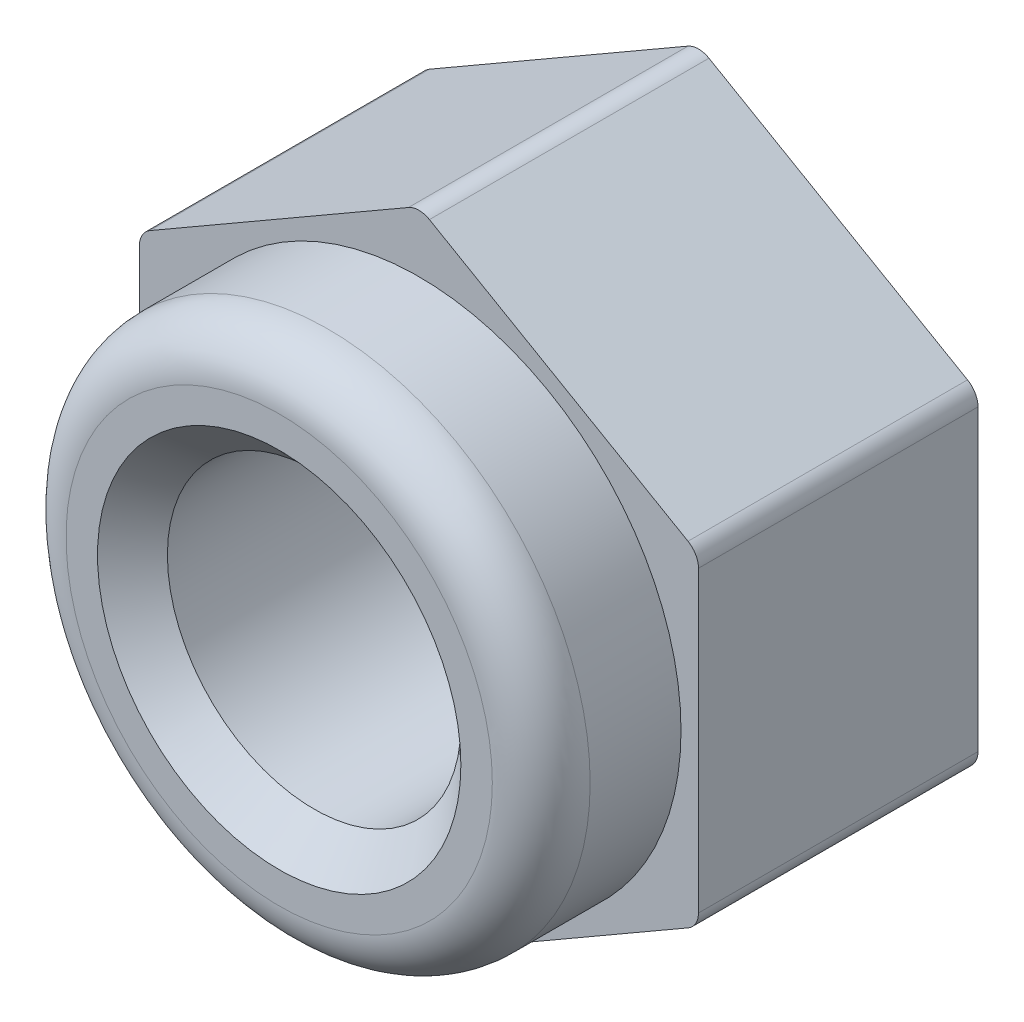
ISO-10303-21;
HEADER;
FILE_DESCRIPTION(('STEP AP214'),'2;1');
FILE_NAME('part.step','',(''),(''),'','','');
FILE_SCHEMA(('AUTOMOTIVE_DESIGN { 1 0 10303 214 1 1 1 1 }'));
ENDSEC;
DATA;
#1=APPLICATION_CONTEXT('core data for automotive mechanical design processes');
#2=APPLICATION_PROTOCOL_DEFINITION('international standard','automotive_design',2000,#1);
#3=PRODUCT_CONTEXT('',#1,'mechanical');
#4=PRODUCT('Part','Part','',(#3));
#5=PRODUCT_RELATED_PRODUCT_CATEGORY('part','',(#4));
#6=PRODUCT_DEFINITION_FORMATION('','',#4);
#7=PRODUCT_DEFINITION_CONTEXT('part definition',#1,'design');
#8=PRODUCT_DEFINITION('design','',#6,#7);
#9=PRODUCT_DEFINITION_SHAPE('','',#8);
#10=(LENGTH_UNIT() NAMED_UNIT(*) SI_UNIT(.MILLI.,.METRE.));
#11=(NAMED_UNIT(*) PLANE_ANGLE_UNIT() SI_UNIT($,.RADIAN.));
#12=(NAMED_UNIT(*) SI_UNIT($,.STERADIAN.) SOLID_ANGLE_UNIT());
#13=UNCERTAINTY_MEASURE_WITH_UNIT(LENGTH_MEASURE(1.E-05),#10,'distance_accuracy_value','');
#14=(GEOMETRIC_REPRESENTATION_CONTEXT(3) GLOBAL_UNCERTAINTY_ASSIGNED_CONTEXT((#13)) GLOBAL_UNIT_ASSIGNED_CONTEXT((#10,
#11,#12)) REPRESENTATION_CONTEXT('',''));
#15=CARTESIAN_POINT('',(0.,0.,0.));
#16=DIRECTION('',(0.,0.,1.));
#17=DIRECTION('',(1.,0.,0.));
#18=AXIS2_PLACEMENT_3D('',#15,#16,#17);
#19=CARTESIAN_POINT('',(-3.7,2.13619599600162,-4.));
#20=DIRECTION('',(0.,0.,1.));
#21=DIRECTION('',(1.,0.,0.));
#22=AXIS2_PLACEMENT_3D('',#19,#20,#21);
#23=CYLINDRICAL_SURFACE('',#22,0.3);
#24=CARTESIAN_POINT('',(-3.7,2.13619599600162,-4.));
#25=DIRECTION('',(0.,0.,-1.));
#26=DIRECTION('',(1.,0.,0.));
#27=AXIS2_PLACEMENT_3D('',#24,#25,#26);
#28=CIRCLE('',#27,0.3);
#29=CARTESIAN_POINT('',(-4.,2.13619599600162,-4.));
#30=VERTEX_POINT('',#29);
#31=CARTESIAN_POINT('',(-3.85,2.39600361713695,-4.));
#32=VERTEX_POINT('',#31);
#33=EDGE_CURVE('E174',#30,#32,#28,.T.);
#34=ORIENTED_EDGE('',*,*,#33,.F.);
#35=DIRECTION('',(0.,0.,-1.));
#36=VECTOR('',#35,1.);
#37=CARTESIAN_POINT('',(-4.,2.13619599600162,-4.));
#38=LINE('',#37,#36);
#39=CARTESIAN_POINT('',(-4.,2.13619599600162,0.));
#40=VERTEX_POINT('',#39);
#41=EDGE_CURVE('E190',#40,#30,#38,.T.);
#42=ORIENTED_EDGE('',*,*,#41,.F.);
#43=CARTESIAN_POINT('',(-3.7,2.13619599600162,0.));
#44=DIRECTION('',(0.,0.,1.));
#45=DIRECTION('',(1.,0.,0.));
#46=AXIS2_PLACEMENT_3D('',#43,#44,#45);
#47=CIRCLE('',#46,0.3);
#48=CARTESIAN_POINT('',(-3.85,2.39600361713695,0.));
#49=VERTEX_POINT('',#48);
#50=EDGE_CURVE('E215',#49,#40,#47,.T.);
#51=ORIENTED_EDGE('',*,*,#50,.F.);
#52=DIRECTION('',(0.,0.,1.));
#53=VECTOR('',#52,1.);
#54=CARTESIAN_POINT('',(-3.85,2.39600361713695,-4.));
#55=LINE('',#54,#53);
#56=EDGE_CURVE('E192',#32,#49,#55,.T.);
#57=ORIENTED_EDGE('',*,*,#56,.F.);
#58=EDGE_LOOP('',(#34,#42,#51,#57));
#59=FACE_BOUND('',#58,.T.);
#60=ADVANCED_FACE('F17',(#59),#23,.T.);
#61=CARTESIAN_POINT('',(0.,4.27239199200323,-4.));
#62=DIRECTION('',(0.,0.,1.));
#63=DIRECTION('',(1.,0.,0.));
#64=AXIS2_PLACEMENT_3D('',#61,#62,#63);
#65=CYLINDRICAL_SURFACE('',#64,0.3);
#66=CARTESIAN_POINT('',(0.,4.27239199200323,-4.));
#67=DIRECTION('',(0.,0.,-1.));
#68=DIRECTION('',(1.,0.,0.));
#69=AXIS2_PLACEMENT_3D('',#66,#67,#68);
#70=CIRCLE('',#69,0.3);
#71=CARTESIAN_POINT('',(-0.149999999999996,4.53219961313856,-4.));
#72=VERTEX_POINT('',#71);
#73=CARTESIAN_POINT('',(0.150000000000003,4.53219961313856,-4.));
#74=VERTEX_POINT('',#73);
#75=EDGE_CURVE('E219',#72,#74,#70,.T.);
#76=ORIENTED_EDGE('',*,*,#75,.F.);
#77=DIRECTION('',(0.,0.,-1.));
#78=VECTOR('',#77,1.);
#79=CARTESIAN_POINT('',(-0.149999999999996,4.53219961313856,-4.));
#80=LINE('',#79,#78);
#81=CARTESIAN_POINT('',(-0.149999999999996,4.53219961313856,0.));
#82=VERTEX_POINT('',#81);
#83=EDGE_CURVE('E242',#82,#72,#80,.T.);
#84=ORIENTED_EDGE('',*,*,#83,.F.);
#85=CARTESIAN_POINT('',(0.,4.27239199200323,0.));
#86=DIRECTION('',(0.,0.,1.));
#87=DIRECTION('',(1.,0.,0.));
#88=AXIS2_PLACEMENT_3D('',#85,#86,#87);
#89=CIRCLE('',#88,0.3);
#90=CARTESIAN_POINT('',(0.150000000000003,4.53219961313856,0.));
#91=VERTEX_POINT('',#90);
#92=EDGE_CURVE('E212',#91,#82,#89,.T.);
#93=ORIENTED_EDGE('',*,*,#92,.F.);
#94=DIRECTION('',(0.,0.,1.));
#95=VECTOR('',#94,1.);
#96=CARTESIAN_POINT('',(0.150000000000004,4.53219961313856,-4.));
#97=LINE('',#96,#95);
#98=EDGE_CURVE('E201',#74,#91,#97,.T.);
#99=ORIENTED_EDGE('',*,*,#98,.F.);
#100=EDGE_LOOP('',(#76,#84,#93,#99));
#101=FACE_BOUND('',#100,.T.);
#102=ADVANCED_FACE('F342',(#101),#65,.T.);
#103=CARTESIAN_POINT('',(3.7,2.13619599600161,-4.));
#104=DIRECTION('',(0.,0.,1.));
#105=DIRECTION('',(1.,0.,0.));
#106=AXIS2_PLACEMENT_3D('',#103,#104,#105);
#107=CYLINDRICAL_SURFACE('',#106,0.3);
#108=CARTESIAN_POINT('',(3.7,2.13619599600161,-4.));
#109=DIRECTION('',(0.,0.,-1.));
#110=DIRECTION('',(1.,0.,0.));
#111=AXIS2_PLACEMENT_3D('',#108,#109,#110);
#112=CIRCLE('',#111,0.3);
#113=CARTESIAN_POINT('',(3.85,2.39600361713694,-4.));
#114=VERTEX_POINT('',#113);
#115=CARTESIAN_POINT('',(4.,2.13619599600161,-4.));
#116=VERTEX_POINT('',#115);
#117=EDGE_CURVE('E222',#114,#116,#112,.T.);
#118=ORIENTED_EDGE('',*,*,#117,.F.);
#119=DIRECTION('',(0.,0.,-1.));
#120=VECTOR('',#119,1.);
#121=CARTESIAN_POINT('',(3.85,2.39600361713694,-4.));
#122=LINE('',#121,#120);
#123=CARTESIAN_POINT('',(3.85,2.39600361713694,0.));
#124=VERTEX_POINT('',#123);
#125=EDGE_CURVE('E241',#124,#114,#122,.T.);
#126=ORIENTED_EDGE('',*,*,#125,.F.);
#127=CARTESIAN_POINT('',(3.7,2.13619599600161,0.));
#128=DIRECTION('',(0.,0.,1.));
#129=DIRECTION('',(1.,0.,0.));
#130=AXIS2_PLACEMENT_3D('',#127,#128,#129);
#131=CIRCLE('',#130,0.3);
#132=CARTESIAN_POINT('',(4.,2.13619599600161,0.));
#133=VERTEX_POINT('',#132);
#134=EDGE_CURVE('E216',#133,#124,#131,.T.);
#135=ORIENTED_EDGE('',*,*,#134,.F.);
#136=DIRECTION('',(0.,0.,1.));
#137=VECTOR('',#136,1.);
#138=CARTESIAN_POINT('',(4.,2.13619599600161,-4.));
#139=LINE('',#138,#137);
#140=EDGE_CURVE('E231',#116,#133,#139,.T.);
#141=ORIENTED_EDGE('',*,*,#140,.F.);
#142=EDGE_LOOP('',(#118,#126,#135,#141));
#143=FACE_BOUND('',#142,.T.);
#144=ADVANCED_FACE('F333',(#143),#107,.T.);
#145=CARTESIAN_POINT('',(3.7,-2.13619599600163,-4.));
#146=DIRECTION('',(0.,0.,1.));
#147=DIRECTION('',(1.,0.,0.));
#148=AXIS2_PLACEMENT_3D('',#145,#146,#147);
#149=CYLINDRICAL_SURFACE('',#148,0.3);
#150=CARTESIAN_POINT('',(3.7,-2.13619599600163,-4.));
#151=DIRECTION('',(0.,0.,-1.));
#152=DIRECTION('',(1.,0.,0.));
#153=AXIS2_PLACEMENT_3D('',#150,#151,#152);
#154=CIRCLE('',#153,0.3);
#155=CARTESIAN_POINT('',(4.,-2.13619599600163,-4.));
#156=VERTEX_POINT('',#155);
#157=CARTESIAN_POINT('',(3.85,-2.39600361713696,-4.));
#158=VERTEX_POINT('',#157);
#159=EDGE_CURVE('E271',#156,#158,#154,.T.);
#160=ORIENTED_EDGE('',*,*,#159,.F.);
#161=DIRECTION('',(0.,0.,-1.));
#162=VECTOR('',#161,1.);
#163=CARTESIAN_POINT('',(4.,-2.13619599600163,-4.));
#164=LINE('',#163,#162);
#165=CARTESIAN_POINT('',(4.,-2.13619599600163,0.));
#166=VERTEX_POINT('',#165);
#167=EDGE_CURVE('E232',#166,#156,#164,.T.);
#168=ORIENTED_EDGE('',*,*,#167,.F.);
#169=CARTESIAN_POINT('',(3.7,-2.13619599600163,0.));
#170=DIRECTION('',(0.,0.,1.));
#171=DIRECTION('',(1.,0.,0.));
#172=AXIS2_PLACEMENT_3D('',#169,#170,#171);
#173=CIRCLE('',#172,0.3);
#174=CARTESIAN_POINT('',(3.85,-2.39600361713696,0.));
#175=VERTEX_POINT('',#174);
#176=EDGE_CURVE('E253',#175,#166,#173,.T.);
#177=ORIENTED_EDGE('',*,*,#176,.F.);
#178=DIRECTION('',(0.,0.,1.));
#179=VECTOR('',#178,1.);
#180=CARTESIAN_POINT('',(3.85,-2.39600361713696,-4.));
#181=LINE('',#180,#179);
#182=EDGE_CURVE('E209',#158,#175,#181,.T.);
#183=ORIENTED_EDGE('',*,*,#182,.F.);
#184=EDGE_LOOP('',(#160,#168,#177,#183));
#185=FACE_BOUND('',#184,.T.);
#186=ADVANCED_FACE('F361',(#185),#149,.T.);
#187=CARTESIAN_POINT('',(0.,-4.27239199200323,-4.));
#188=DIRECTION('',(0.,0.,1.));
#189=DIRECTION('',(1.,0.,0.));
#190=AXIS2_PLACEMENT_3D('',#187,#188,#189);
#191=CYLINDRICAL_SURFACE('',#190,0.3);
#192=CARTESIAN_POINT('',(0.,-4.27239199200323,-4.));
#193=DIRECTION('',(0.,0.,-1.));
#194=DIRECTION('',(1.,0.,0.));
#195=AXIS2_PLACEMENT_3D('',#192,#193,#194);
#196=CIRCLE('',#195,0.3);
#197=CARTESIAN_POINT('',(0.149999999999981,-4.53219961313856,-4.));
#198=VERTEX_POINT('',#197);
#199=CARTESIAN_POINT('',(-0.150000000000019,-4.53219961313856,-4.));
#200=VERTEX_POINT('',#199);
#201=EDGE_CURVE('E274',#198,#200,#196,.T.);
#202=ORIENTED_EDGE('',*,*,#201,.F.);
#203=DIRECTION('',(0.,0.,-1.));
#204=VECTOR('',#203,1.);
#205=CARTESIAN_POINT('',(0.149999999999981,-4.53219961313856,-4.));
#206=LINE('',#205,#204);
#207=CARTESIAN_POINT('',(0.149999999999981,-4.53219961313856,0.));
#208=VERTEX_POINT('',#207);
#209=EDGE_CURVE('E210',#208,#198,#206,.T.);
#210=ORIENTED_EDGE('',*,*,#209,.F.);
#211=CARTESIAN_POINT('',(0.,-4.27239199200323,0.));
#212=DIRECTION('',(0.,0.,1.));
#213=DIRECTION('',(1.,0.,0.));
#214=AXIS2_PLACEMENT_3D('',#211,#212,#213);
#215=CIRCLE('',#214,0.3);
#216=CARTESIAN_POINT('',(-0.150000000000019,-4.53219961313856,0.));
#217=VERTEX_POINT('',#216);
#218=EDGE_CURVE('E256',#217,#208,#215,.T.);
#219=ORIENTED_EDGE('',*,*,#218,.F.);
#220=DIRECTION('',(0.,0.,1.));
#221=VECTOR('',#220,1.);
#222=CARTESIAN_POINT('',(-0.150000000000019,-4.53219961313856,-4.));
#223=LINE('',#222,#221);
#224=EDGE_CURVE('E225',#200,#217,#223,.T.);
#225=ORIENTED_EDGE('',*,*,#224,.F.);
#226=EDGE_LOOP('',(#202,#210,#219,#225));
#227=FACE_BOUND('',#226,.T.);
#228=ADVANCED_FACE('F353',(#227),#191,.T.);
#229=CARTESIAN_POINT('',(-3.7,-2.13619599600161,-4.));
#230=DIRECTION('',(0.,0.,1.));
#231=DIRECTION('',(1.,0.,0.));
#232=AXIS2_PLACEMENT_3D('',#229,#230,#231);
#233=CYLINDRICAL_SURFACE('',#232,0.3);
#234=CARTESIAN_POINT('',(-3.7,-2.13619599600161,-4.));
#235=DIRECTION('',(0.,0.,-1.));
#236=DIRECTION('',(1.,0.,0.));
#237=AXIS2_PLACEMENT_3D('',#234,#235,#236);
#238=CIRCLE('',#237,0.3);
#239=CARTESIAN_POINT('',(-3.85,-2.39600361713694,-4.));
#240=VERTEX_POINT('',#239);
#241=CARTESIAN_POINT('',(-4.,-2.13619599600161,-4.));
#242=VERTEX_POINT('',#241);
#243=EDGE_CURVE('E162',#240,#242,#238,.T.);
#244=ORIENTED_EDGE('',*,*,#243,.F.);
#245=DIRECTION('',(0.,0.,-1.));
#246=VECTOR('',#245,1.);
#247=CARTESIAN_POINT('',(-3.85,-2.39600361713694,-4.));
#248=LINE('',#247,#246);
#249=CARTESIAN_POINT('',(-3.85,-2.39600361713694,0.));
#250=VERTEX_POINT('',#249);
#251=EDGE_CURVE('E226',#250,#240,#248,.T.);
#252=ORIENTED_EDGE('',*,*,#251,.F.);
#253=CARTESIAN_POINT('',(-3.7,-2.13619599600161,0.));
#254=DIRECTION('',(0.,0.,1.));
#255=DIRECTION('',(1.,0.,0.));
#256=AXIS2_PLACEMENT_3D('',#253,#254,#255);
#257=CIRCLE('',#256,0.3);
#258=CARTESIAN_POINT('',(-4.,-2.13619599600161,0.));
#259=VERTEX_POINT('',#258);
#260=EDGE_CURVE('E180',#259,#250,#257,.T.);
#261=ORIENTED_EDGE('',*,*,#260,.F.);
#262=DIRECTION('',(0.,0.,1.));
#263=VECTOR('',#262,1.);
#264=CARTESIAN_POINT('',(-4.,-2.13619599600161,-4.));
#265=LINE('',#264,#263);
#266=EDGE_CURVE('E178',#242,#259,#265,.T.);
#267=ORIENTED_EDGE('',*,*,#266,.F.);
#268=EDGE_LOOP('',(#244,#252,#261,#267));
#269=FACE_BOUND('',#268,.T.);
#270=ADVANCED_FACE('F179',(#269),#233,.T.);
#271=CARTESIAN_POINT('',(0.,0.,1.5));
#272=DIRECTION('',(0.,0.,1.));
#273=DIRECTION('',(1.,0.,0.));
#274=AXIS2_PLACEMENT_3D('',#271,#272,#273);
#275=CONICAL_SURFACE('',#274,2.1,0.7853981625);
#276=CARTESIAN_POINT('',(0.,0.,1.5));
#277=DIRECTION('',(0.,0.,1.));
#278=DIRECTION('',(1.,0.,0.));
#279=AXIS2_PLACEMENT_3D('',#276,#277,#278);
#280=CIRCLE('',#279,2.1);
#281=CARTESIAN_POINT('',(2.1,0.,1.5));
#282=VERTEX_POINT('',#281);
#283=EDGE_CURVE('E262',#282,#282,#280,.T.);
#284=ORIENTED_EDGE('',*,*,#283,.F.);
#285=EDGE_LOOP('',(#284));
#286=FACE_BOUND('',#285,.T.);
#287=CARTESIAN_POINT('',(0.,0.,2.));
#288=DIRECTION('',(0.,0.,-1.));
#289=DIRECTION('',(1.,0.,0.));
#290=AXIS2_PLACEMENT_3D('',#287,#288,#289);
#291=CIRCLE('',#290,2.6);
#292=CARTESIAN_POINT('',(2.6,0.,2.));
#293=VERTEX_POINT('',#292);
#294=EDGE_CURVE('E27',#293,#293,#291,.T.);
#295=ORIENTED_EDGE('',*,*,#294,.F.);
#296=EDGE_LOOP('',(#295));
#297=FACE_BOUND('',#296,.T.);
#298=ADVANCED_FACE('F390',(#286,#297),#275,.F.);
#299=CARTESIAN_POINT('',(0.,0.,-4.));
#300=DIRECTION('',(0.,0.,-1.));
#301=DIRECTION('',(-1.,0.,0.));
#302=AXIS2_PLACEMENT_3D('',#299,#300,#301);
#303=CONICAL_SURFACE('',#302,2.6,0.7853981625);
#304=CARTESIAN_POINT('',(0.,0.,-4.));
#305=DIRECTION('',(0.,0.,1.));
#306=DIRECTION('',(1.,0.,0.));
#307=AXIS2_PLACEMENT_3D('',#304,#305,#306);
#308=CIRCLE('',#307,2.6);
#309=CARTESIAN_POINT('',(2.6,0.,-4.));
#310=VERTEX_POINT('',#309);
#311=EDGE_CURVE('E175',#310,#310,#308,.T.);
#312=ORIENTED_EDGE('',*,*,#311,.F.);
#313=EDGE_LOOP('',(#312));
#314=FACE_BOUND('',#313,.T.);
#315=CARTESIAN_POINT('',(0.,0.,-3.5));
#316=DIRECTION('',(0.,0.,-1.));
#317=DIRECTION('',(1.,0.,0.));
#318=AXIS2_PLACEMENT_3D('',#315,#316,#317);
#319=CIRCLE('',#318,2.1);
#320=CARTESIAN_POINT('',(2.1,0.,-3.5));
#321=VERTEX_POINT('',#320);
#322=EDGE_CURVE('E21',#321,#321,#319,.T.);
#323=ORIENTED_EDGE('',*,*,#322,.F.);
#324=EDGE_LOOP('',(#323));
#325=FACE_BOUND('',#324,.T.);
#326=ADVANCED_FACE('F19',(#314,#325),#303,.F.);
#327=CARTESIAN_POINT('',(0.,0.,1.3));
#328=DIRECTION('',(0.,0.,1.));
#329=DIRECTION('',(1.,0.,0.));
#330=AXIS2_PLACEMENT_3D('',#327,#328,#329);
#331=TOROIDAL_SURFACE('',#330,3.05,0.7);
#332=CARTESIAN_POINT('',(0.,0.,2.));
#333=DIRECTION('',(0.,0.,1.));
#334=DIRECTION('',(1.,0.,0.));
#335=AXIS2_PLACEMENT_3D('',#332,#333,#334);
#336=CIRCLE('',#335,3.05);
#337=CARTESIAN_POINT('',(3.05,0.,2.));
#338=VERTEX_POINT('',#337);
#339=EDGE_CURVE('E11',#338,#338,#336,.T.);
#340=ORIENTED_EDGE('',*,*,#339,.F.);
#341=EDGE_LOOP('',(#340));
#342=FACE_BOUND('',#341,.T.);
#343=CARTESIAN_POINT('',(0.,0.,1.3));
#344=DIRECTION('',(0.,0.,-1.));
#345=DIRECTION('',(1.,0.,0.));
#346=AXIS2_PLACEMENT_3D('',#343,#344,#345);
#347=CIRCLE('',#346,3.75);
#348=CARTESIAN_POINT('',(3.75,0.,1.3));
#349=VERTEX_POINT('',#348);
#350=EDGE_CURVE('E281',#349,#349,#347,.T.);
#351=ORIENTED_EDGE('',*,*,#350,.F.);
#352=EDGE_LOOP('',(#351));
#353=FACE_BOUND('',#352,.T.);
#354=ADVANCED_FACE('F399',(#342,#353),#331,.T.);
#355=CARTESIAN_POINT('',(0.,0.,2.));
#356=DIRECTION('',(0.,0.,1.));
#357=DIRECTION('',(1.,0.,0.));
#358=AXIS2_PLACEMENT_3D('',#355,#356,#357);
#359=PLANE('',#358);
#360=ORIENTED_EDGE('',*,*,#339,.T.);
#361=EDGE_LOOP('',(#360));
#362=FACE_BOUND('',#361,.T.);
#363=ORIENTED_EDGE('',*,*,#294,.T.);
#364=EDGE_LOOP('',(#363));
#365=FACE_BOUND('',#364,.T.);
#366=ADVANCED_FACE('F397',(#362,#365),#359,.T.);
#367=CARTESIAN_POINT('',(0.,0.,2.));
#368=DIRECTION('',(0.,0.,-1.));
#369=DIRECTION('',(-1.,0.,0.));
#370=AXIS2_PLACEMENT_3D('',#367,#368,#369);
#371=CYLINDRICAL_SURFACE('',#370,3.75);
#372=CARTESIAN_POINT('',(0.,0.,0.));
#373=DIRECTION('',(0.,0.,1.));
#374=DIRECTION('',(1.,0.,0.));
#375=AXIS2_PLACEMENT_3D('',#372,#373,#374);
#376=CIRCLE('',#375,3.75);
#377=CARTESIAN_POINT('',(3.75,0.,0.));
#378=VERTEX_POINT('',#377);
#379=EDGE_CURVE('E298',#378,#378,#376,.T.);
#380=ORIENTED_EDGE('',*,*,#379,.T.);
#381=EDGE_LOOP('',(#380));
#382=FACE_BOUND('',#381,.T.);
#383=ORIENTED_EDGE('',*,*,#350,.T.);
#384=EDGE_LOOP('',(#383));
#385=FACE_BOUND('',#384,.T.);
#386=ADVANCED_FACE('F387',(#382,#385),#371,.T.);
#387=CARTESIAN_POINT('',(0.,0.,0.));
#388=DIRECTION('',(0.,0.,1.));
#389=DIRECTION('',(1.,0.,0.));
#390=AXIS2_PLACEMENT_3D('',#387,#388,#389);
#391=PLANE('',#390);
#392=DIRECTION('',(0.,-1.,0.));
#393=VECTOR('',#392,1.);
#394=CARTESIAN_POINT('',(-4.,2.3094010767585,0.));
#395=LINE('',#394,#393);
#396=EDGE_CURVE('E185',#40,#259,#395,.T.);
#397=ORIENTED_EDGE('',*,*,#396,.T.);
#398=ORIENTED_EDGE('',*,*,#260,.T.);
#399=DIRECTION('',(0.866025403784437,-0.5,0.));
#400=VECTOR('',#399,1.);
#401=CARTESIAN_POINT('',(-4.,-2.30940107675849,0.));
#402=LINE('',#401,#400);
#403=EDGE_CURVE('E270',#250,#217,#402,.T.);
#404=ORIENTED_EDGE('',*,*,#403,.T.);
#405=ORIENTED_EDGE('',*,*,#218,.T.);
#406=DIRECTION('',(0.866025403784441,0.5,0.));
#407=VECTOR('',#406,1.);
#408=CARTESIAN_POINT('',(0.,-4.618802153517,0.));
#409=LINE('',#408,#407);
#410=EDGE_CURVE('E250',#208,#175,#409,.T.);
#411=ORIENTED_EDGE('',*,*,#410,.T.);
#412=ORIENTED_EDGE('',*,*,#176,.T.);
#413=DIRECTION('',(0.,1.,0.));
#414=VECTOR('',#413,1.);
#415=CARTESIAN_POINT('',(4.,-2.3094010767585,0.));
#416=LINE('',#415,#414);
#417=EDGE_CURVE('E236',#166,#133,#416,.T.);
#418=ORIENTED_EDGE('',*,*,#417,.T.);
#419=ORIENTED_EDGE('',*,*,#134,.T.);
#420=DIRECTION('',(-0.866025403784438,0.5,0.));
#421=VECTOR('',#420,1.);
#422=CARTESIAN_POINT('',(4.,2.3094010767585,0.));
#423=LINE('',#422,#421);
#424=EDGE_CURVE('E237',#124,#91,#423,.T.);
#425=ORIENTED_EDGE('',*,*,#424,.T.);
#426=ORIENTED_EDGE('',*,*,#92,.T.);
#427=DIRECTION('',(-0.866025403784439,-0.5,0.));
#428=VECTOR('',#427,1.);
#429=CARTESIAN_POINT('',(0.,4.61880215351701,0.));
#430=LINE('',#429,#428);
#431=EDGE_CURVE('E246',#82,#49,#430,.T.);
#432=ORIENTED_EDGE('',*,*,#431,.T.);
#433=ORIENTED_EDGE('',*,*,#50,.T.);
#434=EDGE_LOOP('',(#397,#398,#404,#405,#411,#412,#418,#419,#425,#426,#432,#433));
#435=FACE_BOUND('',#434,.T.);
#436=ORIENTED_EDGE('',*,*,#379,.F.);
#437=EDGE_LOOP('',(#436));
#438=FACE_BOUND('',#437,.T.);
#439=ADVANCED_FACE('F324',(#435,#438),#391,.T.);
#440=CARTESIAN_POINT('',(0.,0.,-4.));
#441=DIRECTION('',(0.,0.,1.));
#442=DIRECTION('',(1.,0.,0.));
#443=AXIS2_PLACEMENT_3D('',#440,#441,#442);
#444=PLANE('',#443);
#445=DIRECTION('',(0.866025403784437,-0.5,0.));
#446=VECTOR('',#445,1.);
#447=CARTESIAN_POINT('',(-4.,-2.30940107675849,-4.));
#448=LINE('',#447,#446);
#449=EDGE_CURVE('E169',#240,#200,#448,.T.);
#450=ORIENTED_EDGE('',*,*,#449,.F.);
#451=ORIENTED_EDGE('',*,*,#243,.T.);
#452=DIRECTION('',(0.,-1.,0.));
#453=VECTOR('',#452,1.);
#454=CARTESIAN_POINT('',(-4.,2.3094010767585,-4.));
#455=LINE('',#454,#453);
#456=EDGE_CURVE('E167',#30,#242,#455,.T.);
#457=ORIENTED_EDGE('',*,*,#456,.F.);
#458=ORIENTED_EDGE('',*,*,#33,.T.);
#459=DIRECTION('',(-0.866025403784439,-0.5,0.));
#460=VECTOR('',#459,1.);
#461=CARTESIAN_POINT('',(0.,4.61880215351701,-4.));
#462=LINE('',#461,#460);
#463=EDGE_CURVE('E198',#72,#32,#462,.T.);
#464=ORIENTED_EDGE('',*,*,#463,.F.);
#465=ORIENTED_EDGE('',*,*,#75,.T.);
#466=DIRECTION('',(-0.866025403784438,0.5,0.));
#467=VECTOR('',#466,1.);
#468=CARTESIAN_POINT('',(4.,2.3094010767585,-4.));
#469=LINE('',#468,#467);
#470=EDGE_CURVE('E205',#114,#74,#469,.T.);
#471=ORIENTED_EDGE('',*,*,#470,.F.);
#472=ORIENTED_EDGE('',*,*,#117,.T.);
#473=DIRECTION('',(0.,1.,0.));
#474=VECTOR('',#473,1.);
#475=CARTESIAN_POINT('',(4.,-2.3094010767585,-4.));
#476=LINE('',#475,#474);
#477=EDGE_CURVE('E227',#156,#116,#476,.T.);
#478=ORIENTED_EDGE('',*,*,#477,.F.);
#479=ORIENTED_EDGE('',*,*,#159,.T.);
#480=DIRECTION('',(0.866025403784441,0.5,0.));
#481=VECTOR('',#480,1.);
#482=CARTESIAN_POINT('',(0.,-4.618802153517,-4.));
#483=LINE('',#482,#481);
#484=EDGE_CURVE('E206',#198,#158,#483,.T.);
#485=ORIENTED_EDGE('',*,*,#484,.F.);
#486=ORIENTED_EDGE('',*,*,#201,.T.);
#487=EDGE_LOOP('',(#450,#451,#457,#458,#464,#465,#471,#472,#478,#479,#485,#486));
#488=FACE_BOUND('',#487,.T.);
#489=ORIENTED_EDGE('',*,*,#311,.T.);
#490=EDGE_LOOP('',(#489));
#491=FACE_BOUND('',#490,.T.);
#492=ADVANCED_FACE('F164',(#488,#491),#444,.F.);
#493=CARTESIAN_POINT('',(0.,0.,-4.));
#494=DIRECTION('',(0.,0.,1.));
#495=DIRECTION('',(1.,0.,0.));
#496=AXIS2_PLACEMENT_3D('',#493,#494,#495);
#497=CYLINDRICAL_SURFACE('',#496,2.1);
#498=ORIENTED_EDGE('',*,*,#283,.T.);
#499=EDGE_LOOP('',(#498));
#500=FACE_BOUND('',#499,.T.);
#501=ORIENTED_EDGE('',*,*,#322,.T.);
#502=EDGE_LOOP('',(#501));
#503=FACE_BOUND('',#502,.T.);
#504=ADVANCED_FACE('F382',(#500,#503),#497,.F.);
#505=CARTESIAN_POINT('',(4.,2.3094010767585,-4.));
#506=DIRECTION('',(0.5,0.866025403784438,0.));
#507=DIRECTION('',(0.,0.,-1.));
#508=AXIS2_PLACEMENT_3D('',#505,#506,#507);
#509=PLANE('',#508);
#510=ORIENTED_EDGE('',*,*,#424,.F.);
#511=ORIENTED_EDGE('',*,*,#125,.T.);
#512=ORIENTED_EDGE('',*,*,#470,.T.);
#513=ORIENTED_EDGE('',*,*,#98,.T.);
#514=EDGE_LOOP('',(#510,#511,#512,#513));
#515=FACE_BOUND('',#514,.T.);
#516=ADVANCED_FACE('F337',(#515),#509,.T.);
#517=CARTESIAN_POINT('',(4.,-2.3094010767585,-4.));
#518=DIRECTION('',(1.,0.,0.));
#519=DIRECTION('',(0.,1.,0.));
#520=AXIS2_PLACEMENT_3D('',#517,#518,#519);
#521=PLANE('',#520);
#522=ORIENTED_EDGE('',*,*,#417,.F.);
#523=ORIENTED_EDGE('',*,*,#167,.T.);
#524=ORIENTED_EDGE('',*,*,#477,.T.);
#525=ORIENTED_EDGE('',*,*,#140,.T.);
#526=EDGE_LOOP('',(#522,#523,#524,#525));
#527=FACE_BOUND('',#526,.T.);
#528=ADVANCED_FACE('F329',(#527),#521,.T.);
#529=CARTESIAN_POINT('',(0.,-4.618802153517,-4.));
#530=DIRECTION('',(0.5,-0.866025403784441,0.));
#531=DIRECTION('',(0.,0.,-1.));
#532=AXIS2_PLACEMENT_3D('',#529,#530,#531);
#533=PLANE('',#532);
#534=ORIENTED_EDGE('',*,*,#410,.F.);
#535=ORIENTED_EDGE('',*,*,#209,.T.);
#536=ORIENTED_EDGE('',*,*,#484,.T.);
#537=ORIENTED_EDGE('',*,*,#182,.T.);
#538=EDGE_LOOP('',(#534,#535,#536,#537));
#539=FACE_BOUND('',#538,.T.);
#540=ADVANCED_FACE('F358',(#539),#533,.T.);
#541=CARTESIAN_POINT('',(-4.,-2.30940107675849,-4.));
#542=DIRECTION('',(-0.5,-0.866025403784437,0.));
#543=DIRECTION('',(-0.866025403784437,0.5,0.));
#544=AXIS2_PLACEMENT_3D('',#541,#542,#543);
#545=PLANE('',#544);
#546=ORIENTED_EDGE('',*,*,#403,.F.);
#547=ORIENTED_EDGE('',*,*,#251,.T.);
#548=ORIENTED_EDGE('',*,*,#449,.T.);
#549=ORIENTED_EDGE('',*,*,#224,.T.);
#550=EDGE_LOOP('',(#546,#547,#548,#549));
#551=FACE_BOUND('',#550,.T.);
#552=ADVANCED_FACE('F350',(#551),#545,.T.);
#553=CARTESIAN_POINT('',(-4.,2.3094010767585,-4.));
#554=DIRECTION('',(-1.,0.,0.));
#555=DIRECTION('',(0.,0.,1.));
#556=AXIS2_PLACEMENT_3D('',#553,#554,#555);
#557=PLANE('',#556);
#558=ORIENTED_EDGE('',*,*,#456,.T.);
#559=ORIENTED_EDGE('',*,*,#266,.T.);
#560=ORIENTED_EDGE('',*,*,#396,.F.);
#561=ORIENTED_EDGE('',*,*,#41,.T.);
#562=EDGE_LOOP('',(#558,#559,#560,#561));
#563=FACE_BOUND('',#562,.T.);
#564=ADVANCED_FACE('F188',(#563),#557,.T.);
#565=CARTESIAN_POINT('',(0.,4.61880215351701,-4.));
#566=DIRECTION('',(-0.5,0.866025403784439,0.));
#567=DIRECTION('',(0.,0.,1.));
#568=AXIS2_PLACEMENT_3D('',#565,#566,#567);
#569=PLANE('',#568);
#570=ORIENTED_EDGE('',*,*,#431,.F.);
#571=ORIENTED_EDGE('',*,*,#83,.T.);
#572=ORIENTED_EDGE('',*,*,#463,.T.);
#573=ORIENTED_EDGE('',*,*,#56,.T.);
#574=EDGE_LOOP('',(#570,#571,#572,#573));
#575=FACE_BOUND('',#574,.T.);
#576=ADVANCED_FACE('F345',(#575),#569,.T.);
#577=CLOSED_SHELL('',(#60,#102,#144,#186,#228,#270,#298,#326,#354,#366,#386,#439,#492,#504,#516,
#528,#540,#552,#564,#576));
#578=MANIFOLD_SOLID_BREP('B1',#577);
#579=ADVANCED_BREP_SHAPE_REPRESENTATION('',(#18,#578),#14);
#580=SHAPE_DEFINITION_REPRESENTATION(#9,#579);
ENDSEC;
END-ISO-10303-21;
